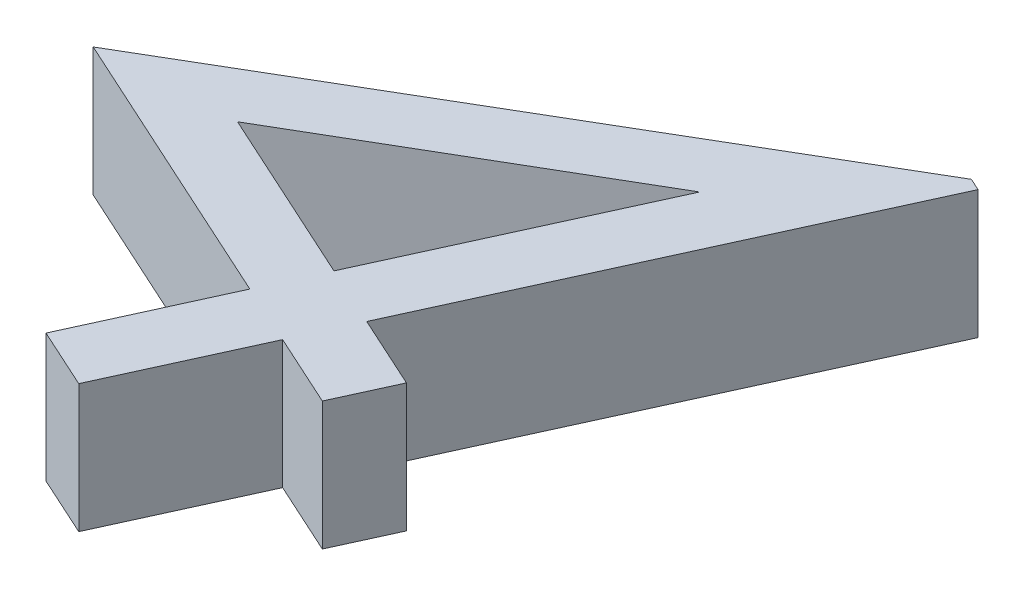
ISO-10303-21;
HEADER;
FILE_DESCRIPTION(('STEP AP214'),'2;1');
FILE_NAME('part.step','',(''),(''),'','','');
FILE_SCHEMA(('AUTOMOTIVE_DESIGN { 1 0 10303 214 1 1 1 1 }'));
ENDSEC;
DATA;
#1=APPLICATION_CONTEXT('core data for automotive mechanical design processes');
#2=APPLICATION_PROTOCOL_DEFINITION('international standard','automotive_design',2000,#1);
#3=PRODUCT_CONTEXT('',#1,'mechanical');
#4=PRODUCT('Part','Part','',(#3));
#5=PRODUCT_RELATED_PRODUCT_CATEGORY('part','',(#4));
#6=PRODUCT_DEFINITION_FORMATION('','',#4);
#7=PRODUCT_DEFINITION_CONTEXT('part definition',#1,'design');
#8=PRODUCT_DEFINITION('design','',#6,#7);
#9=PRODUCT_DEFINITION_SHAPE('','',#8);
#10=(LENGTH_UNIT() NAMED_UNIT(*) SI_UNIT(.MILLI.,.METRE.));
#11=(NAMED_UNIT(*) PLANE_ANGLE_UNIT() SI_UNIT($,.RADIAN.));
#12=(NAMED_UNIT(*) SI_UNIT($,.STERADIAN.) SOLID_ANGLE_UNIT());
#13=UNCERTAINTY_MEASURE_WITH_UNIT(LENGTH_MEASURE(1.E-05),#10,'distance_accuracy_value','');
#14=(GEOMETRIC_REPRESENTATION_CONTEXT(3) GLOBAL_UNCERTAINTY_ASSIGNED_CONTEXT((#13)) GLOBAL_UNIT_ASSIGNED_CONTEXT((#10,
#11,#12)) REPRESENTATION_CONTEXT('',''));
#15=CARTESIAN_POINT('',(0.,0.,0.));
#16=DIRECTION('',(0.,0.,1.));
#17=DIRECTION('',(1.,0.,0.));
#18=AXIS2_PLACEMENT_3D('',#15,#16,#17);
#19=CARTESIAN_POINT('',(-5.48445474219128,7.62,13.3532076053942));
#20=DIRECTION('',(0.,-1.,0.));
#21=DIRECTION('',(0.,0.,-1.));
#22=AXIS2_PLACEMENT_3D('',#19,#20,#21);
#23=PLANE('',#22);
#24=DIRECTION('',(-0.909778139648694,0.,-0.415094852554644));
#25=VECTOR('',#24,1.);
#26=CARTESIAN_POINT('',(-7.13598051676393,7.62,14.6098724357895));
#27=LINE('',#26,#25);
#28=CARTESIAN_POINT('',(-6.43318103759727,7.62,14.9305313233429));
#29=VERTEX_POINT('',#28);
#30=CARTESIAN_POINT('',(-7.13598051676393,7.62,14.6098724357895));
#31=VERTEX_POINT('',#30);
#32=EDGE_CURVE('E171',#29,#31,#27,.T.);
#33=ORIENTED_EDGE('',*,*,#32,.F.);
#34=DIRECTION('',(-0.414751853878113,0.,0.909934557924177));
#35=VECTOR('',#34,1.);
#36=CARTESIAN_POINT('',(-6.43318103759727,7.62,14.9305313233429));
#37=LINE('',#36,#35);
#38=CARTESIAN_POINT('',(-5.97948846281094,7.62,13.9351637352019));
#39=VERTEX_POINT('',#38);
#40=EDGE_CURVE('E165',#39,#29,#37,.T.);
#41=ORIENTED_EDGE('',*,*,#40,.F.);
#42=DIRECTION('',(0.863750184805697,0.,-0.503920249888933));
#43=VECTOR('',#42,1.);
#44=CARTESIAN_POINT('',(-5.97948846281094,7.62,13.9351637352019));
#45=LINE('',#44,#43);
#46=EDGE_CURVE('E167',#31,#39,#45,.T.);
#47=ORIENTED_EDGE('',*,*,#46,.F.);
#48=EDGE_LOOP('',(#33,#41,#47));
#49=FACE_BOUND('',#48,.T.);
#50=DIRECTION('',(-0.414588604675921,0.,0.910008949886139));
#51=VECTOR('',#50,1.);
#52=CARTESIAN_POINT('',(-6.79041093877248,7.62,15.7144230501058));
#53=LINE('',#52,#51);
#54=CARTESIAN_POINT('',(-6.53759393156094,7.62,15.1594976694968));
#55=VERTEX_POINT('',#54);
#56=CARTESIAN_POINT('',(-6.79041093877248,7.62,15.7144230501058));
#57=VERTEX_POINT('',#56);
#58=EDGE_CURVE('E152',#55,#57,#53,.T.);
#59=ORIENTED_EDGE('',*,*,#58,.F.);
#60=DIRECTION('',(0.909830245176954,0.,0.414980632031477));
#61=VECTOR('',#60,1.);
#62=CARTESIAN_POINT('',(-6.53759393156094,7.62,15.1594976694968));
#63=LINE('',#62,#61);
#64=CARTESIAN_POINT('',(-7.67871555949898,7.62,14.6390232437489));
#65=VERTEX_POINT('',#64);
#66=EDGE_CURVE('E156',#65,#55,#63,.T.);
#67=ORIENTED_EDGE('',*,*,#66,.F.);
#68=DIRECTION('',(-0.862779474971018,0.,0.505580436299442));
#69=VECTOR('',#68,1.);
#70=CARTESIAN_POINT('',(-7.67871555949898,7.62,14.6390232437489));
#71=LINE('',#70,#69);
#72=CARTESIAN_POINT('',(-5.48445474219128,7.62,13.3532076053942));
#73=VERTEX_POINT('',#72);
#74=EDGE_CURVE('E125',#73,#65,#71,.T.);
#75=ORIENTED_EDGE('',*,*,#74,.F.);
#76=DIRECTION('',(-0.907959384500448,0.,-0.419058177461755));
#77=VECTOR('',#76,1.);
#78=CARTESIAN_POINT('',(-5.48445474219128,7.62,13.3532076053942));
#79=LINE('',#78,#77);
#80=CARTESIAN_POINT('',(-5.43622340538573,7.62,13.3754682223814));
#81=VERTEX_POINT('',#80);
#82=EDGE_CURVE('E20',#81,#73,#79,.T.);
#83=ORIENTED_EDGE('',*,*,#82,.F.);
#84=DIRECTION('',(0.414807318390975,0.,-0.909909274933105));
#85=VECTOR('',#84,1.);
#86=CARTESIAN_POINT('',(-5.43622340538573,7.62,13.3754682223814));
#87=LINE('',#86,#85);
#88=CARTESIAN_POINT('',(-6.19467442702034,7.62,15.039184334828));
#89=VERTEX_POINT('',#88);
#90=EDGE_CURVE('E113',#89,#81,#87,.T.);
#91=ORIENTED_EDGE('',*,*,#90,.F.);
#92=DIRECTION('',(-0.909852161034773,0.,-0.414932578933437));
#93=VECTOR('',#92,1.);
#94=CARTESIAN_POINT('',(-6.19467442702034,7.62,15.039184334828));
#95=LINE('',#94,#93);
#96=CARTESIAN_POINT('',(-5.90528640618702,7.62,15.1711579926805));
#97=VERTEX_POINT('',#96);
#98=EDGE_CURVE('E108',#97,#89,#95,.T.);
#99=ORIENTED_EDGE('',*,*,#98,.F.);
#100=DIRECTION('',(0.414913419017047,0.,-0.90986089855515));
#101=VECTOR('',#100,1.);
#102=CARTESIAN_POINT('',(-5.90528640618701,7.62,15.1711579926805));
#103=LINE('',#102,#101);
#104=CARTESIAN_POINT('',(-6.00969930015069,7.62,15.4001243388344));
#105=VERTEX_POINT('',#104);
#106=EDGE_CURVE('E136',#105,#97,#103,.T.);
#107=ORIENTED_EDGE('',*,*,#106,.F.);
#108=DIRECTION('',(0.909852161034772,0.,0.414932578933441));
#109=VECTOR('',#108,1.);
#110=CARTESIAN_POINT('',(-6.00969930015068,7.62,15.4001243388344));
#111=LINE('',#110,#109);
#112=CARTESIAN_POINT('',(-6.29908732098402,7.62,15.2681506809818));
#113=VERTEX_POINT('',#112);
#114=EDGE_CURVE('E140',#113,#105,#111,.T.);
#115=ORIENTED_EDGE('',*,*,#114,.F.);
#116=DIRECTION('',(0.414588604675921,0.,-0.910008949886139));
#117=VECTOR('',#116,1.);
#118=CARTESIAN_POINT('',(-6.29908732098402,7.62,15.2681506809818));
#119=LINE('',#118,#117);
#120=CARTESIAN_POINT('',(-6.55190432819556,7.62,15.8230760615908));
#121=VERTEX_POINT('',#120);
#122=EDGE_CURVE('E144',#121,#113,#119,.T.);
#123=ORIENTED_EDGE('',*,*,#122,.F.);
#124=DIRECTION('',(0.91001988021935,0.,0.414564612099924));
#125=VECTOR('',#124,1.);
#126=CARTESIAN_POINT('',(-6.55190432819556,7.62,15.8230760615908));
#127=LINE('',#126,#125);
#128=EDGE_CURVE('E148',#57,#121,#127,.T.);
#129=ORIENTED_EDGE('',*,*,#128,.F.);
#130=EDGE_LOOP('',(#59,#67,#75,#83,#91,#99,#107,#115,#123,#129));
#131=FACE_BOUND('',#130,.T.);
#132=ADVANCED_FACE('F17',(#49,#131),#23,.T.);
#133=CARTESIAN_POINT('',(-5.48445474219128,8.128,13.3532076053942));
#134=DIRECTION('',(0.419058177461755,0.,-0.907959384500448));
#135=DIRECTION('',(-0.907959384500448,0.,-0.419058177461755));
#136=AXIS2_PLACEMENT_3D('',#133,#134,#135);
#137=PLANE('',#136);
#138=DIRECTION('',(0.907959384500282,0.,0.419058177462116));
#139=VECTOR('',#138,1.);
#140=CARTESIAN_POINT('',(-5.48445474219128,8.128,13.3532076053942));
#141=LINE('',#140,#139);
#142=CARTESIAN_POINT('',(-5.48445474219128,8.128,13.3532076053942));
#143=VERTEX_POINT('',#142);
#144=CARTESIAN_POINT('',(-5.43622340538573,8.128,13.3754682223814));
#145=VERTEX_POINT('',#144);
#146=EDGE_CURVE('E131',#143,#145,#141,.T.);
#147=ORIENTED_EDGE('',*,*,#146,.T.);
#148=DIRECTION('',(0.,1.,0.));
#149=VECTOR('',#148,1.);
#150=CARTESIAN_POINT('',(-5.43622340538573,8.128,13.3754682223814));
#151=LINE('',#150,#149);
#152=EDGE_CURVE('E118',#81,#145,#151,.T.);
#153=ORIENTED_EDGE('',*,*,#152,.F.);
#154=ORIENTED_EDGE('',*,*,#82,.T.);
#155=DIRECTION('',(0.,1.,0.));
#156=VECTOR('',#155,1.);
#157=CARTESIAN_POINT('',(-5.48445474219128,8.128,13.3532076053942));
#158=LINE('',#157,#156);
#159=EDGE_CURVE('E163',#143,#73,#158,.F.);
#160=ORIENTED_EDGE('',*,*,#159,.F.);
#161=EDGE_LOOP('',(#147,#153,#154,#160));
#162=FACE_BOUND('',#161,.T.);
#163=ADVANCED_FACE('F130',(#162),#137,.T.);
#164=CARTESIAN_POINT('',(-5.43622340538573,8.128,13.3754682223814));
#165=DIRECTION('',(0.909909274933105,0.,0.414807318390975));
#166=DIRECTION('',(0.414807318390975,0.,-0.909909274933105));
#167=AXIS2_PLACEMENT_3D('',#164,#165,#166);
#168=PLANE('',#167);
#169=DIRECTION('',(-0.414807318390969,0.,0.909909274933107));
#170=VECTOR('',#169,1.);
#171=CARTESIAN_POINT('',(-5.43622340538573,8.128,13.3754682223814));
#172=LINE('',#171,#170);
#173=CARTESIAN_POINT('',(-6.19467442702035,8.128,15.039184334828));
#174=VERTEX_POINT('',#173);
#175=EDGE_CURVE('E178',#145,#174,#172,.T.);
#176=ORIENTED_EDGE('',*,*,#175,.T.);
#177=DIRECTION('',(0.,1.,0.));
#178=VECTOR('',#177,1.);
#179=CARTESIAN_POINT('',(-6.19467442702034,8.128,15.039184334828));
#180=LINE('',#179,#178);
#181=EDGE_CURVE('E120',#89,#174,#180,.T.);
#182=ORIENTED_EDGE('',*,*,#181,.F.);
#183=ORIENTED_EDGE('',*,*,#90,.T.);
#184=ORIENTED_EDGE('',*,*,#152,.T.);
#185=EDGE_LOOP('',(#176,#182,#183,#184));
#186=FACE_BOUND('',#185,.T.);
#187=ADVANCED_FACE('F116',(#186),#168,.T.);
#188=CARTESIAN_POINT('',(-6.19467442702034,8.128,15.039184334828));
#189=DIRECTION('',(0.414932578933437,0.,-0.909852161034773));
#190=DIRECTION('',(-0.909852161034773,0.,-0.414932578933437));
#191=AXIS2_PLACEMENT_3D('',#188,#189,#190);
#192=PLANE('',#191);
#193=DIRECTION('',(0.909852161034846,0.,0.414932578933278));
#194=VECTOR('',#193,1.);
#195=CARTESIAN_POINT('',(-6.19467442702034,8.128,15.039184334828));
#196=LINE('',#195,#194);
#197=CARTESIAN_POINT('',(-5.90528640618702,8.128,15.1711579926805));
#198=VERTEX_POINT('',#197);
#199=EDGE_CURVE('E180',#174,#198,#196,.T.);
#200=ORIENTED_EDGE('',*,*,#199,.T.);
#201=DIRECTION('',(0.,1.,0.));
#202=VECTOR('',#201,1.);
#203=CARTESIAN_POINT('',(-5.90528640618701,8.128,15.1711579926805));
#204=LINE('',#203,#202);
#205=EDGE_CURVE('E138',#97,#198,#204,.T.);
#206=ORIENTED_EDGE('',*,*,#205,.F.);
#207=ORIENTED_EDGE('',*,*,#98,.T.);
#208=ORIENTED_EDGE('',*,*,#181,.T.);
#209=EDGE_LOOP('',(#200,#206,#207,#208));
#210=FACE_BOUND('',#209,.T.);
#211=ADVANCED_FACE('F260',(#210),#192,.T.);
#212=CARTESIAN_POINT('',(-5.90528640618701,8.128,15.1711579926805));
#213=DIRECTION('',(0.90986089855515,0.,0.414913419017047));
#214=DIRECTION('',(0.414913419017047,0.,-0.90986089855515));
#215=AXIS2_PLACEMENT_3D('',#212,#213,#214);
#216=PLANE('',#215);
#217=DIRECTION('',(-0.414913419016951,0.,0.909860898555193));
#218=VECTOR('',#217,1.);
#219=CARTESIAN_POINT('',(-5.90528640618701,8.128,15.1711579926805));
#220=LINE('',#219,#218);
#221=CARTESIAN_POINT('',(-6.00969930015069,8.128,15.4001243388344));
#222=VERTEX_POINT('',#221);
#223=EDGE_CURVE('E183',#198,#222,#220,.T.);
#224=ORIENTED_EDGE('',*,*,#223,.T.);
#225=DIRECTION('',(0.,1.,0.));
#226=VECTOR('',#225,1.);
#227=CARTESIAN_POINT('',(-6.00969930015068,8.128,15.4001243388344));
#228=LINE('',#227,#226);
#229=EDGE_CURVE('E142',#105,#222,#228,.T.);
#230=ORIENTED_EDGE('',*,*,#229,.F.);
#231=ORIENTED_EDGE('',*,*,#106,.T.);
#232=ORIENTED_EDGE('',*,*,#205,.T.);
#233=EDGE_LOOP('',(#224,#230,#231,#232));
#234=FACE_BOUND('',#233,.T.);
#235=ADVANCED_FACE('F256',(#234),#216,.T.);
#236=CARTESIAN_POINT('',(-6.00969930015068,8.128,15.4001243388344));
#237=DIRECTION('',(-0.414932578933441,0.,0.909852161034772));
#238=DIRECTION('',(0.909852161034772,0.,0.414932578933441));
#239=AXIS2_PLACEMENT_3D('',#236,#237,#238);
#240=PLANE('',#239);
#241=DIRECTION('',(-0.909852161034732,0.,-0.414932578933528));
#242=VECTOR('',#241,1.);
#243=CARTESIAN_POINT('',(-6.00969930015068,8.128,15.4001243388344));
#244=LINE('',#243,#242);
#245=CARTESIAN_POINT('',(-6.29908732098403,8.128,15.2681506809818));
#246=VERTEX_POINT('',#245);
#247=EDGE_CURVE('E186',#222,#246,#244,.T.);
#248=ORIENTED_EDGE('',*,*,#247,.T.);
#249=DIRECTION('',(0.,1.,0.));
#250=VECTOR('',#249,1.);
#251=CARTESIAN_POINT('',(-6.29908732098402,8.128,15.2681506809818));
#252=LINE('',#251,#250);
#253=EDGE_CURVE('E146',#113,#246,#252,.T.);
#254=ORIENTED_EDGE('',*,*,#253,.F.);
#255=ORIENTED_EDGE('',*,*,#114,.T.);
#256=ORIENTED_EDGE('',*,*,#229,.T.);
#257=EDGE_LOOP('',(#248,#254,#255,#256));
#258=FACE_BOUND('',#257,.T.);
#259=ADVANCED_FACE('F252',(#258),#240,.T.);
#260=CARTESIAN_POINT('',(-6.29908732098402,8.128,15.2681506809818));
#261=DIRECTION('',(0.910008949886139,0.,0.414588604675921));
#262=DIRECTION('',(0.414588604675921,0.,-0.910008949886139));
#263=AXIS2_PLACEMENT_3D('',#260,#261,#262);
#264=PLANE('',#263);
#265=DIRECTION('',(-0.414588604675906,0.,0.910008949886145));
#266=VECTOR('',#265,1.);
#267=CARTESIAN_POINT('',(-6.29908732098402,8.128,15.2681506809818));
#268=LINE('',#267,#266);
#269=CARTESIAN_POINT('',(-6.55190432819556,8.128,15.8230760615908));
#270=VERTEX_POINT('',#269);
#271=EDGE_CURVE('E189',#246,#270,#268,.T.);
#272=ORIENTED_EDGE('',*,*,#271,.T.);
#273=DIRECTION('',(0.,1.,0.));
#274=VECTOR('',#273,1.);
#275=CARTESIAN_POINT('',(-6.55190432819556,8.128,15.8230760615908));
#276=LINE('',#275,#274);
#277=EDGE_CURVE('E150',#121,#270,#276,.T.);
#278=ORIENTED_EDGE('',*,*,#277,.F.);
#279=ORIENTED_EDGE('',*,*,#122,.T.);
#280=ORIENTED_EDGE('',*,*,#253,.T.);
#281=EDGE_LOOP('',(#272,#278,#279,#280));
#282=FACE_BOUND('',#281,.T.);
#283=ADVANCED_FACE('F248',(#282),#264,.T.);
#284=CARTESIAN_POINT('',(-6.55190432819556,8.128,15.8230760615908));
#285=DIRECTION('',(-0.414564612099924,0.,0.91001988021935));
#286=DIRECTION('',(0.91001988021935,0.,0.414564612099924));
#287=AXIS2_PLACEMENT_3D('',#284,#285,#286);
#288=PLANE('',#287);
#289=DIRECTION('',(-0.910019880219408,0.,-0.414564612099797));
#290=VECTOR('',#289,1.);
#291=CARTESIAN_POINT('',(-6.55190432819556,8.128,15.8230760615908));
#292=LINE('',#291,#290);
#293=CARTESIAN_POINT('',(-6.79041093877247,8.128,15.7144230501058));
#294=VERTEX_POINT('',#293);
#295=EDGE_CURVE('E192',#270,#294,#292,.T.);
#296=ORIENTED_EDGE('',*,*,#295,.T.);
#297=DIRECTION('',(0.,1.,0.));
#298=VECTOR('',#297,1.);
#299=CARTESIAN_POINT('',(-6.79041093877248,8.128,15.7144230501058));
#300=LINE('',#299,#298);
#301=EDGE_CURVE('E154',#57,#294,#300,.T.);
#302=ORIENTED_EDGE('',*,*,#301,.F.);
#303=ORIENTED_EDGE('',*,*,#128,.T.);
#304=ORIENTED_EDGE('',*,*,#277,.T.);
#305=EDGE_LOOP('',(#296,#302,#303,#304));
#306=FACE_BOUND('',#305,.T.);
#307=ADVANCED_FACE('F244',(#306),#288,.T.);
#308=CARTESIAN_POINT('',(-6.79041093877248,8.128,15.7144230501058));
#309=DIRECTION('',(-0.910008949886139,0.,-0.414588604675921));
#310=DIRECTION('',(-0.414588604675921,0.,0.910008949886139));
#311=AXIS2_PLACEMENT_3D('',#308,#309,#310);
#312=PLANE('',#311);
#313=DIRECTION('',(0.414588604675906,0.,-0.910008949886145));
#314=VECTOR('',#313,1.);
#315=CARTESIAN_POINT('',(-6.79041093877248,8.128,15.7144230501058));
#316=LINE('',#315,#314);
#317=CARTESIAN_POINT('',(-6.53759393156094,8.128,15.1594976694968));
#318=VERTEX_POINT('',#317);
#319=EDGE_CURVE('E195',#294,#318,#316,.T.);
#320=ORIENTED_EDGE('',*,*,#319,.T.);
#321=DIRECTION('',(0.,1.,0.));
#322=VECTOR('',#321,1.);
#323=CARTESIAN_POINT('',(-6.53759393156094,8.128,15.1594976694968));
#324=LINE('',#323,#322);
#325=EDGE_CURVE('E158',#55,#318,#324,.T.);
#326=ORIENTED_EDGE('',*,*,#325,.F.);
#327=ORIENTED_EDGE('',*,*,#58,.T.);
#328=ORIENTED_EDGE('',*,*,#301,.T.);
#329=EDGE_LOOP('',(#320,#326,#327,#328));
#330=FACE_BOUND('',#329,.T.);
#331=ADVANCED_FACE('F240',(#330),#312,.T.);
#332=CARTESIAN_POINT('',(-6.53759393156094,8.128,15.1594976694968));
#333=DIRECTION('',(-0.414980632031477,0.,0.909830245176954));
#334=DIRECTION('',(0.909830245176954,0.,0.414980632031477));
#335=AXIS2_PLACEMENT_3D('',#332,#333,#334);
#336=PLANE('',#335);
#337=DIRECTION('',(-0.909830245176944,0.,-0.414980632031498));
#338=VECTOR('',#337,1.);
#339=CARTESIAN_POINT('',(-6.53759393156094,8.128,15.1594976694968));
#340=LINE('',#339,#338);
#341=CARTESIAN_POINT('',(-7.67871555949899,8.128,14.6390232437489));
#342=VERTEX_POINT('',#341);
#343=EDGE_CURVE('E198',#318,#342,#340,.T.);
#344=ORIENTED_EDGE('',*,*,#343,.T.);
#345=DIRECTION('',(0.,1.,0.));
#346=VECTOR('',#345,1.);
#347=CARTESIAN_POINT('',(-7.67871555949898,8.128,14.6390232437489));
#348=LINE('',#347,#346);
#349=EDGE_CURVE('E161',#65,#342,#348,.T.);
#350=ORIENTED_EDGE('',*,*,#349,.F.);
#351=ORIENTED_EDGE('',*,*,#66,.T.);
#352=ORIENTED_EDGE('',*,*,#325,.T.);
#353=EDGE_LOOP('',(#344,#350,#351,#352));
#354=FACE_BOUND('',#353,.T.);
#355=ADVANCED_FACE('F236',(#354),#336,.T.);
#356=CARTESIAN_POINT('',(-7.67871555949898,8.128,14.6390232437489));
#357=DIRECTION('',(-0.505580436299442,0.,-0.862779474971018));
#358=DIRECTION('',(-0.862779474971018,0.,0.505580436299442));
#359=AXIS2_PLACEMENT_3D('',#356,#357,#358);
#360=PLANE('',#359);
#361=DIRECTION('',(0.862779474971019,0.,-0.50558043629944));
#362=VECTOR('',#361,1.);
#363=CARTESIAN_POINT('',(-7.67871555949898,8.128,14.6390232437489));
#364=LINE('',#363,#362);
#365=EDGE_CURVE('E201',#342,#143,#364,.T.);
#366=ORIENTED_EDGE('',*,*,#365,.T.);
#367=ORIENTED_EDGE('',*,*,#159,.T.);
#368=ORIENTED_EDGE('',*,*,#74,.T.);
#369=ORIENTED_EDGE('',*,*,#349,.T.);
#370=EDGE_LOOP('',(#366,#367,#368,#369));
#371=FACE_BOUND('',#370,.T.);
#372=ADVANCED_FACE('F233',(#371),#360,.T.);
#373=CARTESIAN_POINT('',(-6.43318103759727,8.128,14.9305313233429));
#374=DIRECTION('',(-0.909934557924177,0.,-0.414751853878113));
#375=DIRECTION('',(-0.414751853878113,0.,0.909934557924177));
#376=AXIS2_PLACEMENT_3D('',#373,#374,#375);
#377=PLANE('',#376);
#378=DIRECTION('',(0.414751853878126,0.,-0.909934557924171));
#379=VECTOR('',#378,1.);
#380=CARTESIAN_POINT('',(-6.43318103759727,8.128,14.9305313233429));
#381=LINE('',#380,#379);
#382=CARTESIAN_POINT('',(-6.43318103759727,8.128,14.9305313233429));
#383=VERTEX_POINT('',#382);
#384=CARTESIAN_POINT('',(-5.97948846281095,8.128,13.9351637352019));
#385=VERTEX_POINT('',#384);
#386=EDGE_CURVE('E204',#383,#385,#381,.T.);
#387=ORIENTED_EDGE('',*,*,#386,.T.);
#388=DIRECTION('',(0.,1.,0.));
#389=VECTOR('',#388,1.);
#390=CARTESIAN_POINT('',(-5.97948846281094,8.128,13.9351637352019));
#391=LINE('',#390,#389);
#392=EDGE_CURVE('E169',#39,#385,#391,.T.);
#393=ORIENTED_EDGE('',*,*,#392,.F.);
#394=ORIENTED_EDGE('',*,*,#40,.T.);
#395=DIRECTION('',(0.,1.,0.));
#396=VECTOR('',#395,1.);
#397=CARTESIAN_POINT('',(-6.43318103759727,8.128,14.9305313233429));
#398=LINE('',#397,#396);
#399=EDGE_CURVE('E174',#383,#29,#398,.F.);
#400=ORIENTED_EDGE('',*,*,#399,.F.);
#401=EDGE_LOOP('',(#387,#393,#394,#400));
#402=FACE_BOUND('',#401,.T.);
#403=ADVANCED_FACE('F217',(#402),#377,.T.);
#404=CARTESIAN_POINT('',(-5.97948846281094,8.128,13.9351637352019));
#405=DIRECTION('',(0.503920249888933,0.,0.863750184805697));
#406=DIRECTION('',(0.863750184805697,0.,-0.503920249888933));
#407=AXIS2_PLACEMENT_3D('',#404,#405,#406);
#408=PLANE('',#407);
#409=DIRECTION('',(-0.8637501848057,0.,0.503920249888928));
#410=VECTOR('',#409,1.);
#411=CARTESIAN_POINT('',(-5.97948846281094,8.128,13.9351637352019));
#412=LINE('',#411,#410);
#413=CARTESIAN_POINT('',(-7.13598051676393,8.128,14.6098724357895));
#414=VERTEX_POINT('',#413);
#415=EDGE_CURVE('E26',#385,#414,#412,.T.);
#416=ORIENTED_EDGE('',*,*,#415,.T.);
#417=DIRECTION('',(0.,1.,0.));
#418=VECTOR('',#417,1.);
#419=CARTESIAN_POINT('',(-7.13598051676393,8.128,14.6098724357895));
#420=LINE('',#419,#418);
#421=EDGE_CURVE('E34',#31,#414,#420,.T.);
#422=ORIENTED_EDGE('',*,*,#421,.F.);
#423=ORIENTED_EDGE('',*,*,#46,.T.);
#424=ORIENTED_EDGE('',*,*,#392,.T.);
#425=EDGE_LOOP('',(#416,#422,#423,#424));
#426=FACE_BOUND('',#425,.T.);
#427=ADVANCED_FACE('F210',(#426),#408,.T.);
#428=CARTESIAN_POINT('',(-7.13598051676393,8.128,14.6098724357895));
#429=DIRECTION('',(0.415094852554644,0.,-0.909778139648694));
#430=DIRECTION('',(-0.909778139648694,0.,-0.415094852554644));
#431=AXIS2_PLACEMENT_3D('',#428,#429,#430);
#432=PLANE('',#431);
#433=DIRECTION('',(0.909778139648701,0.,0.415094852554628));
#434=VECTOR('',#433,1.);
#435=CARTESIAN_POINT('',(-7.13598051676393,8.128,14.6098724357895));
#436=LINE('',#435,#434);
#437=EDGE_CURVE('E11',#414,#383,#436,.T.);
#438=ORIENTED_EDGE('',*,*,#437,.T.);
#439=ORIENTED_EDGE('',*,*,#399,.T.);
#440=ORIENTED_EDGE('',*,*,#32,.T.);
#441=ORIENTED_EDGE('',*,*,#421,.T.);
#442=EDGE_LOOP('',(#438,#439,#440,#441));
#443=FACE_BOUND('',#442,.T.);
#444=ADVANCED_FACE('F220',(#443),#432,.T.);
#445=CARTESIAN_POINT('',(-5.48445474219128,8.128,13.3532076053942));
#446=DIRECTION('',(0.,-1.,0.));
#447=DIRECTION('',(0.,0.,-1.));
#448=AXIS2_PLACEMENT_3D('',#445,#446,#447);
#449=PLANE('',#448);
#450=ORIENTED_EDGE('',*,*,#415,.F.);
#451=ORIENTED_EDGE('',*,*,#386,.F.);
#452=ORIENTED_EDGE('',*,*,#437,.F.);
#453=EDGE_LOOP('',(#450,#451,#452));
#454=FACE_BOUND('',#453,.T.);
#455=ORIENTED_EDGE('',*,*,#343,.F.);
#456=ORIENTED_EDGE('',*,*,#319,.F.);
#457=ORIENTED_EDGE('',*,*,#295,.F.);
#458=ORIENTED_EDGE('',*,*,#271,.F.);
#459=ORIENTED_EDGE('',*,*,#247,.F.);
#460=ORIENTED_EDGE('',*,*,#223,.F.);
#461=ORIENTED_EDGE('',*,*,#199,.F.);
#462=ORIENTED_EDGE('',*,*,#175,.F.);
#463=ORIENTED_EDGE('',*,*,#146,.F.);
#464=ORIENTED_EDGE('',*,*,#365,.F.);
#465=EDGE_LOOP('',(#455,#456,#457,#458,#459,#460,#461,#462,#463,#464));
#466=FACE_BOUND('',#465,.T.);
#467=ADVANCED_FACE('F213',(#454,#466),#449,.F.);
#468=CLOSED_SHELL('',(#132,#163,#187,#211,#235,#259,#283,#307,#331,#355,#372,#403,#427,#444,#467));
#469=MANIFOLD_SOLID_BREP('B1',#468);
#470=ADVANCED_BREP_SHAPE_REPRESENTATION('',(#18,#469),#14);
#471=SHAPE_DEFINITION_REPRESENTATION(#9,#470);
ENDSEC;
END-ISO-10303-21;
